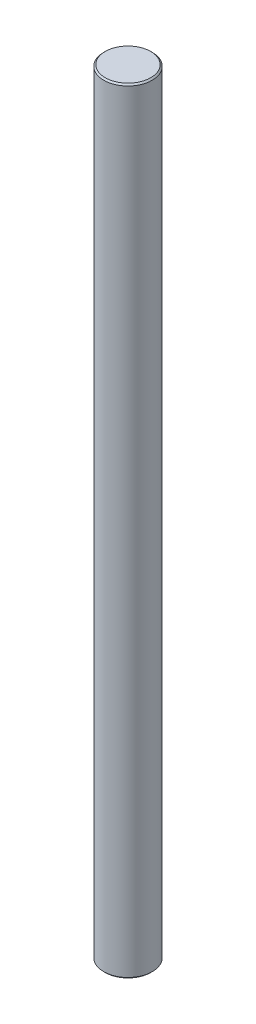
ISO-10303-21;
HEADER;
FILE_DESCRIPTION(('STEP AP214'),'2;1');
FILE_NAME('part.step','',(''),(''),'','','');
FILE_SCHEMA(('AUTOMOTIVE_DESIGN { 1 0 10303 214 1 1 1 1 }'));
ENDSEC;
DATA;
#1=APPLICATION_CONTEXT('core data for automotive mechanical design processes');
#2=APPLICATION_PROTOCOL_DEFINITION('international standard','automotive_design',2000,#1);
#3=PRODUCT_CONTEXT('',#1,'mechanical');
#4=PRODUCT('Part','Part','',(#3));
#5=PRODUCT_RELATED_PRODUCT_CATEGORY('part','',(#4));
#6=PRODUCT_DEFINITION_FORMATION('','',#4);
#7=PRODUCT_DEFINITION_CONTEXT('part definition',#1,'design');
#8=PRODUCT_DEFINITION('design','',#6,#7);
#9=PRODUCT_DEFINITION_SHAPE('','',#8);
#10=(LENGTH_UNIT() NAMED_UNIT(*) SI_UNIT(.MILLI.,.METRE.));
#11=(NAMED_UNIT(*) PLANE_ANGLE_UNIT() SI_UNIT($,.RADIAN.));
#12=(NAMED_UNIT(*) SI_UNIT($,.STERADIAN.) SOLID_ANGLE_UNIT());
#13=UNCERTAINTY_MEASURE_WITH_UNIT(LENGTH_MEASURE(1.E-05),#10,'distance_accuracy_value','');
#14=(GEOMETRIC_REPRESENTATION_CONTEXT(3) GLOBAL_UNCERTAINTY_ASSIGNED_CONTEXT((#13)) GLOBAL_UNIT_ASSIGNED_CONTEXT((#10,
#11,#12)) REPRESENTATION_CONTEXT('',''));
#15=CARTESIAN_POINT('',(0.,0.,0.));
#16=DIRECTION('',(0.,0.,1.));
#17=DIRECTION('',(1.,0.,0.));
#18=AXIS2_PLACEMENT_3D('',#15,#16,#17);
#19=CARTESIAN_POINT('',(4.99999999999998,160.,0.));
#20=DIRECTION('',(0.,-1.,0.));
#21=DIRECTION('',(1.,0.,0.));
#22=AXIS2_PLACEMENT_3D('',#19,#20,#21);
#23=PLANE('',#22);
#24=CARTESIAN_POINT('',(0.,160.,0.));
#25=DIRECTION('',(0.,-1.,0.));
#26=DIRECTION('',(1.,0.,0.));
#27=AXIS2_PLACEMENT_3D('',#24,#25,#26);
#28=CIRCLE('',#27,4.7);
#29=CARTESIAN_POINT('',(4.7,160.,0.));
#30=VERTEX_POINT('',#29);
#31=EDGE_CURVE('E45',#30,#30,#28,.F.);
#32=ORIENTED_EDGE('',*,*,#31,.T.);
#33=EDGE_LOOP('',(#32));
#34=FACE_BOUND('',#33,.T.);
#35=ADVANCED_FACE('F30',(#34),#23,.F.);
#36=CARTESIAN_POINT('',(0.,160.,0.));
#37=DIRECTION('',(0.,1.,0.));
#38=DIRECTION('',(-1.,0.,0.));
#39=AXIS2_PLACEMENT_3D('',#36,#37,#38);
#40=CYLINDRICAL_SURFACE('',#39,4.99999999999999);
#41=CARTESIAN_POINT('',(0.,159.7,0.));
#42=DIRECTION('',(0.,-1.,0.));
#43=DIRECTION('',(1.,0.,0.));
#44=AXIS2_PLACEMENT_3D('',#41,#42,#43);
#45=CIRCLE('',#44,4.99999999999999);
#46=CARTESIAN_POINT('',(4.99999999999999,159.7,0.));
#47=VERTEX_POINT('',#46);
#48=EDGE_CURVE('E37',#47,#47,#45,.T.);
#49=ORIENTED_EDGE('',*,*,#48,.T.);
#50=EDGE_LOOP('',(#49));
#51=FACE_BOUND('',#50,.T.);
#52=CARTESIAN_POINT('',(0.,0.299999999999995,0.));
#53=DIRECTION('',(0.,1.,0.));
#54=DIRECTION('',(-1.,0.,0.));
#55=AXIS2_PLACEMENT_3D('',#52,#53,#54);
#56=CIRCLE('',#55,4.99999999999999);
#57=CARTESIAN_POINT('',(-4.99999999999999,0.299999999999995,0.));
#58=VERTEX_POINT('',#57);
#59=EDGE_CURVE('E41',#58,#58,#56,.T.);
#60=ORIENTED_EDGE('',*,*,#59,.T.);
#61=EDGE_LOOP('',(#60));
#62=FACE_BOUND('',#61,.T.);
#63=ADVANCED_FACE('F61',(#51,#62),#40,.T.);
#64=CARTESIAN_POINT('',(5.,0.,0.));
#65=DIRECTION('',(0.,1.,0.));
#66=DIRECTION('',(-1.,0.,0.));
#67=AXIS2_PLACEMENT_3D('',#64,#65,#66);
#68=PLANE('',#67);
#69=CARTESIAN_POINT('',(0.,0.,0.));
#70=DIRECTION('',(0.,1.,0.));
#71=DIRECTION('',(-1.,0.,0.));
#72=AXIS2_PLACEMENT_3D('',#69,#70,#71);
#73=CIRCLE('',#72,4.69999999999998);
#74=CARTESIAN_POINT('',(-4.69999999999998,0.,0.));
#75=VERTEX_POINT('',#74);
#76=EDGE_CURVE('E10',#75,#75,#73,.F.);
#77=ORIENTED_EDGE('',*,*,#76,.T.);
#78=EDGE_LOOP('',(#77));
#79=FACE_BOUND('',#78,.T.);
#80=ADVANCED_FACE('F54',(#79),#68,.F.);
#81=CARTESIAN_POINT('',(0.,160.,0.));
#82=DIRECTION('',(0.,-1.,0.));
#83=DIRECTION('',(1.,0.,0.));
#84=AXIS2_PLACEMENT_3D('',#81,#82,#83);
#85=CONICAL_SURFACE('',#84,4.7,0.785398163397489);
#86=ORIENTED_EDGE('',*,*,#48,.F.);
#87=EDGE_LOOP('',(#86));
#88=FACE_BOUND('',#87,.T.);
#89=ORIENTED_EDGE('',*,*,#31,.F.);
#90=EDGE_LOOP('',(#89));
#91=FACE_BOUND('',#90,.T.);
#92=ADVANCED_FACE('F52',(#88,#91),#85,.T.);
#93=CARTESIAN_POINT('',(0.,0.299999999999995,0.));
#94=DIRECTION('',(0.,1.,0.));
#95=DIRECTION('',(-1.,0.,0.));
#96=AXIS2_PLACEMENT_3D('',#93,#94,#95);
#97=CONICAL_SURFACE('',#96,4.99999999999999,0.785398163397466);
#98=ORIENTED_EDGE('',*,*,#76,.F.);
#99=EDGE_LOOP('',(#98));
#100=FACE_BOUND('',#99,.T.);
#101=ORIENTED_EDGE('',*,*,#59,.F.);
#102=EDGE_LOOP('',(#101));
#103=FACE_BOUND('',#102,.T.);
#104=ADVANCED_FACE('F32',(#100,#103),#97,.T.);
#105=CLOSED_SHELL('',(#35,#63,#80,#92,#104));
#106=MANIFOLD_SOLID_BREP('B2',#105);
#107=ADVANCED_BREP_SHAPE_REPRESENTATION('',(#18,#106),#14);
#108=SHAPE_DEFINITION_REPRESENTATION(#9,#107);
ENDSEC;
END-ISO-10303-21;
